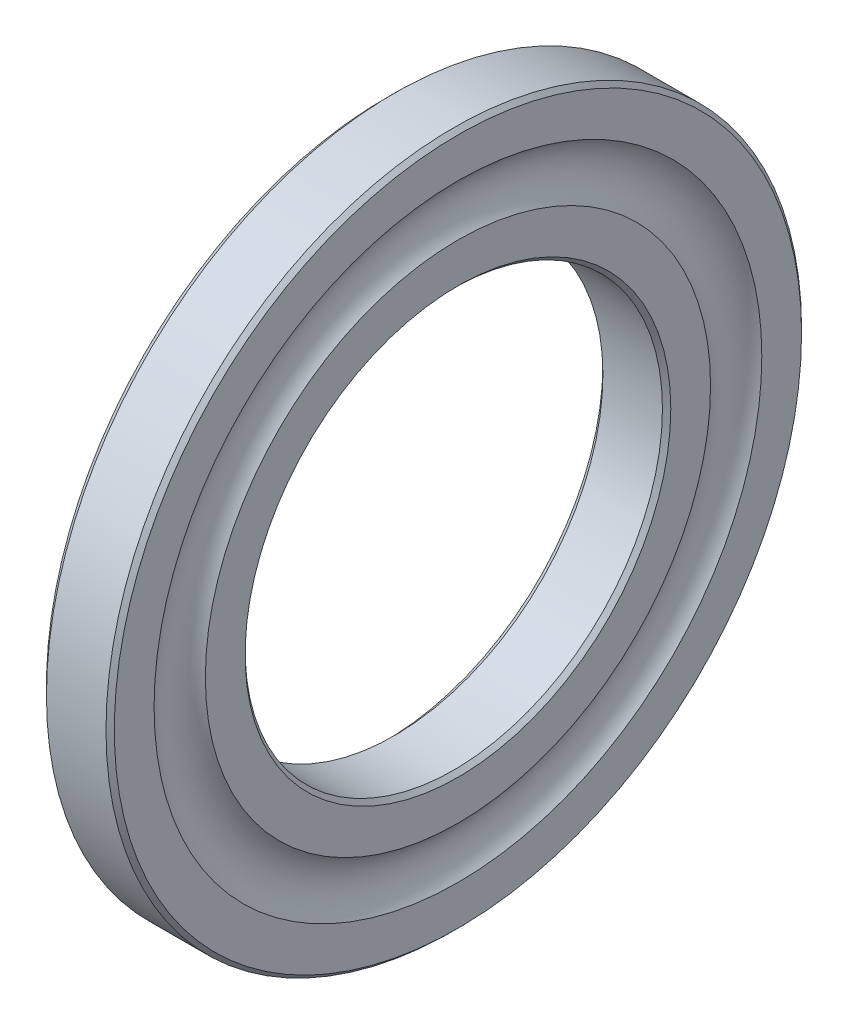
ISO-10303-21;
HEADER;
FILE_DESCRIPTION(('STEP AP214'),'2;1');
FILE_NAME('part.step','',(''),(''),'','','');
FILE_SCHEMA(('AUTOMOTIVE_DESIGN { 1 0 10303 214 1 1 1 1 }'));
ENDSEC;
DATA;
#1=APPLICATION_CONTEXT('core data for automotive mechanical design processes');
#2=APPLICATION_PROTOCOL_DEFINITION('international standard','automotive_design',2000,#1);
#3=PRODUCT_CONTEXT('',#1,'mechanical');
#4=PRODUCT('Part','Part','',(#3));
#5=PRODUCT_RELATED_PRODUCT_CATEGORY('part','',(#4));
#6=PRODUCT_DEFINITION_FORMATION('','',#4);
#7=PRODUCT_DEFINITION_CONTEXT('part definition',#1,'design');
#8=PRODUCT_DEFINITION('design','',#6,#7);
#9=PRODUCT_DEFINITION_SHAPE('','',#8);
#10=(LENGTH_UNIT() NAMED_UNIT(*) SI_UNIT(.MILLI.,.METRE.));
#11=(NAMED_UNIT(*) PLANE_ANGLE_UNIT() SI_UNIT($,.RADIAN.));
#12=(NAMED_UNIT(*) SI_UNIT($,.STERADIAN.) SOLID_ANGLE_UNIT());
#13=UNCERTAINTY_MEASURE_WITH_UNIT(LENGTH_MEASURE(1.E-05),#10,'distance_accuracy_value','');
#14=(GEOMETRIC_REPRESENTATION_CONTEXT(3) GLOBAL_UNCERTAINTY_ASSIGNED_CONTEXT((#13)) GLOBAL_UNIT_ASSIGNED_CONTEXT((#10,
#11,#12)) REPRESENTATION_CONTEXT('',''));
#15=CARTESIAN_POINT('',(0.,0.,0.));
#16=DIRECTION('',(0.,0.,1.));
#17=DIRECTION('',(1.,0.,0.));
#18=AXIS2_PLACEMENT_3D('',#15,#16,#17);
#19=CARTESIAN_POINT('',(0.,0.,20.));
#20=DIRECTION('',(-1.,0.,0.));
#21=DIRECTION('',(0.,0.,1.));
#22=AXIS2_PLACEMENT_3D('',#19,#20,#21);
#23=PLANE('',#22);
#24=CARTESIAN_POINT('',(0.,0.,0.));
#25=DIRECTION('',(1.,0.,0.));
#26=DIRECTION('',(0.,0.,1.));
#27=AXIS2_PLACEMENT_3D('',#24,#25,#26);
#28=CIRCLE('',#27,15.6);
#29=CARTESIAN_POINT('',(0.,0.,-15.6));
#30=VERTEX_POINT('',#29);
#31=EDGE_CURVE('E20',#30,#30,#28,.T.);
#32=ORIENTED_EDGE('',*,*,#31,.T.);
#33=EDGE_LOOP('',(#32));
#34=FACE_BOUND('',#33,.T.);
#35=CARTESIAN_POINT('',(0.,0.,0.));
#36=DIRECTION('',(1.,0.,0.));
#37=DIRECTION('',(0.,0.,1.));
#38=AXIS2_PLACEMENT_3D('',#35,#36,#37);
#39=CIRCLE('',#38,24.4);
#40=CARTESIAN_POINT('',(0.,0.,-24.4));
#41=VERTEX_POINT('',#40);
#42=EDGE_CURVE('E11',#41,#41,#39,.T.);
#43=ORIENTED_EDGE('',*,*,#42,.F.);
#44=EDGE_LOOP('',(#43));
#45=FACE_BOUND('',#44,.T.);
#46=ADVANCED_FACE('F17',(#34,#45),#23,.T.);
#47=CARTESIAN_POINT('',(5.18,0.,16.7286287393238));
#48=DIRECTION('',(1.,0.,0.));
#49=DIRECTION('',(0.,0.,1.));
#50=AXIS2_PLACEMENT_3D('',#47,#48,#49);
#51=PLANE('',#50);
#52=CARTESIAN_POINT('',(5.18,0.,0.));
#53=DIRECTION('',(1.,0.,0.));
#54=DIRECTION('',(0.,0.,1.));
#55=AXIS2_PLACEMENT_3D('',#52,#53,#54);
#56=CIRCLE('',#55,15.3);
#57=CARTESIAN_POINT('',(5.18,0.,-15.3));
#58=VERTEX_POINT('',#57);
#59=EDGE_CURVE('E73',#58,#58,#56,.T.);
#60=ORIENTED_EDGE('',*,*,#59,.F.);
#61=EDGE_LOOP('',(#60));
#62=FACE_BOUND('',#61,.T.);
#63=CARTESIAN_POINT('',(5.18,0.,0.));
#64=DIRECTION('',(1.,0.,0.));
#65=DIRECTION('',(0.,0.,1.));
#66=AXIS2_PLACEMENT_3D('',#63,#64,#65);
#67=CIRCLE('',#66,18.1572574786477);
#68=CARTESIAN_POINT('',(5.18,0.,18.1572574786477));
#69=VERTEX_POINT('',#68);
#70=EDGE_CURVE('E62',#69,#69,#67,.T.);
#71=ORIENTED_EDGE('',*,*,#70,.T.);
#72=EDGE_LOOP('',(#71));
#73=FACE_BOUND('',#72,.T.);
#74=ADVANCED_FACE('F125',(#62,#73),#51,.T.);
#75=CARTESIAN_POINT('',(5.18,0.,23.2713712606762));
#76=DIRECTION('',(1.,0.,0.));
#77=DIRECTION('',(0.,0.,-1.));
#78=AXIS2_PLACEMENT_3D('',#75,#76,#77);
#79=PLANE('',#78);
#80=CARTESIAN_POINT('',(5.18,0.,0.));
#81=DIRECTION('',(1.,0.,0.));
#82=DIRECTION('',(0.,0.,1.));
#83=AXIS2_PLACEMENT_3D('',#80,#81,#82);
#84=CIRCLE('',#83,21.8427425213523);
#85=CARTESIAN_POINT('',(5.18,21.8427425213523,0.));
#86=VERTEX_POINT('',#85);
#87=EDGE_CURVE('E84',#86,#86,#84,.T.);
#88=ORIENTED_EDGE('',*,*,#87,.F.);
#89=EDGE_LOOP('',(#88));
#90=FACE_BOUND('',#89,.T.);
#91=CARTESIAN_POINT('',(5.18,0.,0.));
#92=DIRECTION('',(1.,0.,0.));
#93=DIRECTION('',(0.,0.,1.));
#94=AXIS2_PLACEMENT_3D('',#91,#92,#93);
#95=CIRCLE('',#94,24.7);
#96=CARTESIAN_POINT('',(5.18,0.,-24.7));
#97=VERTEX_POINT('',#96);
#98=EDGE_CURVE('E79',#97,#97,#95,.T.);
#99=ORIENTED_EDGE('',*,*,#98,.T.);
#100=EDGE_LOOP('',(#99));
#101=FACE_BOUND('',#100,.T.);
#102=ADVANCED_FACE('F80',(#90,#101),#79,.T.);
#103=CARTESIAN_POINT('',(0.3,0.,0.));
#104=DIRECTION('',(1.,0.,0.));
#105=DIRECTION('',(0.,0.,1.));
#106=AXIS2_PLACEMENT_3D('',#103,#104,#105);
#107=CONICAL_SURFACE('',#106,24.7,0.78539816339745);
#108=ORIENTED_EDGE('',*,*,#42,.T.);
#109=EDGE_LOOP('',(#108));
#110=FACE_BOUND('',#109,.T.);
#111=CARTESIAN_POINT('',(0.6,0.,0.));
#112=DIRECTION('',(1.,0.,0.));
#113=DIRECTION('',(0.,0.,1.));
#114=AXIS2_PLACEMENT_3D('',#111,#112,#113);
#115=CIRCLE('',#114,25.);
#116=CARTESIAN_POINT('',(0.6,0.,-25.));
#117=VERTEX_POINT('',#116);
#118=EDGE_CURVE('E27',#117,#117,#115,.T.);
#119=ORIENTED_EDGE('',*,*,#118,.F.);
#120=EDGE_LOOP('',(#119));
#121=FACE_BOUND('',#120,.T.);
#122=ADVANCED_FACE('F159',(#110,#121),#107,.T.);
#123=CARTESIAN_POINT('',(2.74,0.,0.));
#124=DIRECTION('',(1.,0.,0.));
#125=DIRECTION('',(0.,0.,1.));
#126=AXIS2_PLACEMENT_3D('',#123,#124,#125);
#127=CYLINDRICAL_SURFACE('',#126,25.);
#128=ORIENTED_EDGE('',*,*,#118,.T.);
#129=EDGE_LOOP('',(#128));
#130=FACE_BOUND('',#129,.T.);
#131=CARTESIAN_POINT('',(4.88,0.,0.));
#132=DIRECTION('',(1.,0.,0.));
#133=DIRECTION('',(0.,0.,1.));
#134=AXIS2_PLACEMENT_3D('',#131,#132,#133);
#135=CIRCLE('',#134,25.);
#136=CARTESIAN_POINT('',(4.88,0.,-25.));
#137=VERTEX_POINT('',#136);
#138=EDGE_CURVE('E83',#137,#137,#135,.T.);
#139=ORIENTED_EDGE('',*,*,#138,.F.);
#140=EDGE_LOOP('',(#139));
#141=FACE_BOUND('',#140,.T.);
#142=ADVANCED_FACE('F143',(#130,#141),#127,.T.);
#143=CARTESIAN_POINT('',(5.03,0.,0.));
#144=DIRECTION('',(-1.,0.,0.));
#145=DIRECTION('',(0.,0.,1.));
#146=AXIS2_PLACEMENT_3D('',#143,#144,#145);
#147=CONICAL_SURFACE('',#146,24.85,0.78539816339745);
#148=ORIENTED_EDGE('',*,*,#138,.T.);
#149=EDGE_LOOP('',(#148));
#150=FACE_BOUND('',#149,.T.);
#151=ORIENTED_EDGE('',*,*,#98,.F.);
#152=EDGE_LOOP('',(#151));
#153=FACE_BOUND('',#152,.T.);
#154=ADVANCED_FACE('F137',(#150,#153),#147,.T.);
#155=CARTESIAN_POINT('',(7.,0.,0.));
#156=DIRECTION('',(1.,0.,0.));
#157=DIRECTION('',(0.,1.,0.));
#158=AXIS2_PLACEMENT_3D('',#155,#156,#157);
#159=TOROIDAL_SURFACE('',#158,20.,2.59);
#160=ORIENTED_EDGE('',*,*,#87,.T.);
#161=EDGE_LOOP('',(#160));
#162=FACE_BOUND('',#161,.T.);
#163=ORIENTED_EDGE('',*,*,#70,.F.);
#164=EDGE_LOOP('',(#163));
#165=FACE_BOUND('',#164,.T.);
#166=ADVANCED_FACE('F142',(#162,#165),#159,.F.);
#167=CARTESIAN_POINT('',(5.03,0.,0.));
#168=DIRECTION('',(1.,0.,0.));
#169=DIRECTION('',(0.,0.,1.));
#170=AXIS2_PLACEMENT_3D('',#167,#168,#169);
#171=CONICAL_SURFACE('',#170,15.15,0.78539816339745);
#172=CARTESIAN_POINT('',(4.88,0.,0.));
#173=DIRECTION('',(1.,0.,0.));
#174=DIRECTION('',(0.,0.,1.));
#175=AXIS2_PLACEMENT_3D('',#172,#173,#174);
#176=CIRCLE('',#175,15.);
#177=CARTESIAN_POINT('',(4.88,0.,-15.));
#178=VERTEX_POINT('',#177);
#179=EDGE_CURVE('E92',#178,#178,#176,.T.);
#180=ORIENTED_EDGE('',*,*,#179,.F.);
#181=EDGE_LOOP('',(#180));
#182=FACE_BOUND('',#181,.T.);
#183=ORIENTED_EDGE('',*,*,#59,.T.);
#184=EDGE_LOOP('',(#183));
#185=FACE_BOUND('',#184,.T.);
#186=ADVANCED_FACE('F116',(#182,#185),#171,.F.);
#187=CARTESIAN_POINT('',(2.74,0.,0.));
#188=DIRECTION('',(1.,0.,0.));
#189=DIRECTION('',(0.,0.,1.));
#190=AXIS2_PLACEMENT_3D('',#187,#188,#189);
#191=CYLINDRICAL_SURFACE('',#190,15.);
#192=CARTESIAN_POINT('',(0.6,0.,0.));
#193=DIRECTION('',(1.,0.,0.));
#194=DIRECTION('',(0.,0.,1.));
#195=AXIS2_PLACEMENT_3D('',#192,#193,#194);
#196=CIRCLE('',#195,15.);
#197=CARTESIAN_POINT('',(0.6,0.,-15.));
#198=VERTEX_POINT('',#197);
#199=EDGE_CURVE('E95',#198,#198,#196,.T.);
#200=ORIENTED_EDGE('',*,*,#199,.F.);
#201=EDGE_LOOP('',(#200));
#202=FACE_BOUND('',#201,.T.);
#203=ORIENTED_EDGE('',*,*,#179,.T.);
#204=EDGE_LOOP('',(#203));
#205=FACE_BOUND('',#204,.T.);
#206=ADVANCED_FACE('F110',(#202,#205),#191,.F.);
#207=CARTESIAN_POINT('',(0.3,0.,0.));
#208=DIRECTION('',(-1.,0.,0.));
#209=DIRECTION('',(0.,0.,1.));
#210=AXIS2_PLACEMENT_3D('',#207,#208,#209);
#211=CONICAL_SURFACE('',#210,15.3,0.78539816339745);
#212=ORIENTED_EDGE('',*,*,#31,.F.);
#213=EDGE_LOOP('',(#212));
#214=FACE_BOUND('',#213,.T.);
#215=ORIENTED_EDGE('',*,*,#199,.T.);
#216=EDGE_LOOP('',(#215));
#217=FACE_BOUND('',#216,.T.);
#218=ADVANCED_FACE('F115',(#214,#217),#211,.F.);
#219=CLOSED_SHELL('',(#46,#74,#102,#122,#142,#154,#166,#186,#206,#218));
#220=MANIFOLD_SOLID_BREP('B1',#219);
#221=ADVANCED_BREP_SHAPE_REPRESENTATION('',(#18,#220),#14);
#222=SHAPE_DEFINITION_REPRESENTATION(#9,#221);
ENDSEC;
END-ISO-10303-21;
